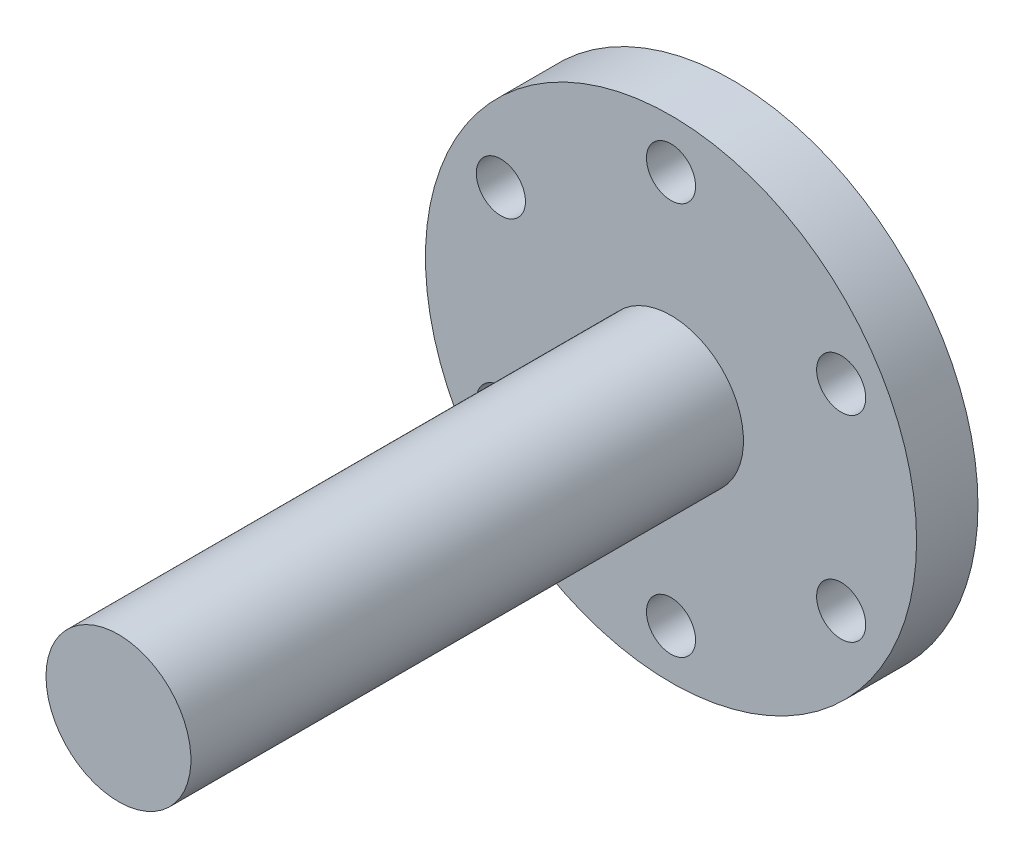
ISO-10303-21;
HEADER;
FILE_DESCRIPTION(('STEP AP214'),'2;1');
FILE_NAME('part.step','',(''),(''),'','','');
FILE_SCHEMA(('AUTOMOTIVE_DESIGN { 1 0 10303 214 1 1 1 1 }'));
ENDSEC;
DATA;
#1=APPLICATION_CONTEXT('core data for automotive mechanical design processes');
#2=APPLICATION_PROTOCOL_DEFINITION('international standard','automotive_design',2000,#1);
#3=PRODUCT_CONTEXT('',#1,'mechanical');
#4=PRODUCT('Part','Part','',(#3));
#5=PRODUCT_RELATED_PRODUCT_CATEGORY('part','',(#4));
#6=PRODUCT_DEFINITION_FORMATION('','',#4);
#7=PRODUCT_DEFINITION_CONTEXT('part definition',#1,'design');
#8=PRODUCT_DEFINITION('design','',#6,#7);
#9=PRODUCT_DEFINITION_SHAPE('','',#8);
#10=(LENGTH_UNIT() NAMED_UNIT(*) SI_UNIT(.MILLI.,.METRE.));
#11=(NAMED_UNIT(*) PLANE_ANGLE_UNIT() SI_UNIT($,.RADIAN.));
#12=(NAMED_UNIT(*) SI_UNIT($,.STERADIAN.) SOLID_ANGLE_UNIT());
#13=UNCERTAINTY_MEASURE_WITH_UNIT(LENGTH_MEASURE(1.E-05),#10,'distance_accuracy_value','');
#14=(GEOMETRIC_REPRESENTATION_CONTEXT(3) GLOBAL_UNCERTAINTY_ASSIGNED_CONTEXT((#13)) GLOBAL_UNIT_ASSIGNED_CONTEXT((#10,
#11,#12)) REPRESENTATION_CONTEXT('',''));
#15=CARTESIAN_POINT('',(0.,0.,0.));
#16=DIRECTION('',(0.,0.,1.));
#17=DIRECTION('',(1.,0.,0.));
#18=AXIS2_PLACEMENT_3D('',#15,#16,#17);
#19=CARTESIAN_POINT('',(0.,0.,5.));
#20=DIRECTION('',(0.,0.,-1.));
#21=DIRECTION('',(-1.,0.,0.));
#22=AXIS2_PLACEMENT_3D('',#19,#20,#21);
#23=CYLINDRICAL_SURFACE('',#22,20.);
#24=CARTESIAN_POINT('',(0.,0.,5.));
#25=DIRECTION('',(0.,0.,1.));
#26=DIRECTION('',(1.,0.,0.));
#27=AXIS2_PLACEMENT_3D('',#24,#25,#26);
#28=CIRCLE('',#27,20.);
#29=CARTESIAN_POINT('',(20.,0.,5.));
#30=VERTEX_POINT('',#29);
#31=EDGE_CURVE('E43',#30,#30,#28,.T.);
#32=ORIENTED_EDGE('',*,*,#31,.F.);
#33=EDGE_LOOP('',(#32));
#34=FACE_BOUND('',#33,.T.);
#35=CARTESIAN_POINT('',(0.,0.,0.));
#36=DIRECTION('',(0.,0.,1.));
#37=DIRECTION('',(1.,0.,0.));
#38=AXIS2_PLACEMENT_3D('',#35,#36,#37);
#39=CIRCLE('',#38,20.);
#40=CARTESIAN_POINT('',(20.,0.,0.));
#41=VERTEX_POINT('',#40);
#42=EDGE_CURVE('E39',#41,#41,#39,.T.);
#43=ORIENTED_EDGE('',*,*,#42,.T.);
#44=EDGE_LOOP('',(#43));
#45=FACE_BOUND('',#44,.T.);
#46=ADVANCED_FACE('F36',(#34,#45),#23,.T.);
#47=CARTESIAN_POINT('',(0.,0.,5.));
#48=DIRECTION('',(0.,0.,1.));
#49=DIRECTION('',(1.,0.,0.));
#50=AXIS2_PLACEMENT_3D('',#47,#48,#49);
#51=PLANE('',#50);
#52=CARTESIAN_POINT('',(0.,16.,5.));
#53=DIRECTION('',(0.,0.,1.));
#54=DIRECTION('',(1.,0.,0.));
#55=AXIS2_PLACEMENT_3D('',#52,#53,#54);
#56=CIRCLE('',#55,2.);
#57=CARTESIAN_POINT('',(2.,16.,5.));
#58=VERTEX_POINT('',#57);
#59=EDGE_CURVE('E78',#58,#58,#56,.T.);
#60=ORIENTED_EDGE('',*,*,#59,.F.);
#61=EDGE_LOOP('',(#60));
#62=FACE_BOUND('',#61,.T.);
#63=CARTESIAN_POINT('',(-13.8564064605506,7.99999999999921,5.));
#64=DIRECTION('',(0.,0.,1.));
#65=DIRECTION('',(1.,0.,0.));
#66=AXIS2_PLACEMENT_3D('',#63,#64,#65);
#67=CIRCLE('',#66,2.00000000000085);
#68=CARTESIAN_POINT('',(-11.8564064605497,7.99999999999921,5.));
#69=VERTEX_POINT('',#68);
#70=EDGE_CURVE('E79',#69,#69,#67,.T.);
#71=ORIENTED_EDGE('',*,*,#70,.F.);
#72=EDGE_LOOP('',(#71));
#73=FACE_BOUND('',#72,.T.);
#74=CARTESIAN_POINT('',(-13.8564064605497,-8.00000000000079,5.));
#75=DIRECTION('',(0.,0.,1.));
#76=DIRECTION('',(1.,0.,0.));
#77=AXIS2_PLACEMENT_3D('',#74,#75,#76);
#78=CIRCLE('',#77,2.00000000000168);
#79=CARTESIAN_POINT('',(-11.856406460548,-8.00000000000079,5.));
#80=VERTEX_POINT('',#79);
#81=EDGE_CURVE('E53',#80,#80,#78,.T.);
#82=ORIENTED_EDGE('',*,*,#81,.F.);
#83=EDGE_LOOP('',(#82));
#84=FACE_BOUND('',#83,.T.);
#85=CARTESIAN_POINT('',(1.81311109890995E-12,-16.,5.));
#86=DIRECTION('',(0.,0.,1.));
#87=DIRECTION('',(1.,0.,0.));
#88=AXIS2_PLACEMENT_3D('',#85,#86,#87);
#89=CIRCLE('',#88,2.00000000000184);
#90=CARTESIAN_POINT('',(2.00000000000365,-16.,5.));
#91=VERTEX_POINT('',#90);
#92=EDGE_CURVE('E60',#91,#91,#89,.T.);
#93=ORIENTED_EDGE('',*,*,#92,.F.);
#94=EDGE_LOOP('',(#93));
#95=FACE_BOUND('',#94,.T.);
#96=CARTESIAN_POINT('',(13.8564064605524,-7.99999999999921,5.));
#97=DIRECTION('',(0.,0.,1.));
#98=DIRECTION('',(1.,0.,0.));
#99=AXIS2_PLACEMENT_3D('',#96,#97,#98);
#100=CIRCLE('',#99,2.00000000000115);
#101=CARTESIAN_POINT('',(15.8564064605535,-7.99999999999921,5.));
#102=VERTEX_POINT('',#101);
#103=EDGE_CURVE('E66',#102,#102,#100,.T.);
#104=ORIENTED_EDGE('',*,*,#103,.F.);
#105=EDGE_LOOP('',(#104));
#106=FACE_BOUND('',#105,.T.);
#107=CARTESIAN_POINT('',(13.8564064605515,8.00000000000079,5.));
#108=DIRECTION('',(0.,0.,1.));
#109=DIRECTION('',(1.,0.,0.));
#110=AXIS2_PLACEMENT_3D('',#107,#108,#109);
#111=CIRCLE('',#110,2.00000000000025);
#112=CARTESIAN_POINT('',(15.8564064605517,8.00000000000079,5.));
#113=VERTEX_POINT('',#112);
#114=EDGE_CURVE('E72',#113,#113,#111,.T.);
#115=ORIENTED_EDGE('',*,*,#114,.F.);
#116=EDGE_LOOP('',(#115));
#117=FACE_BOUND('',#116,.T.);
#118=CARTESIAN_POINT('',(0.,0.,5.));
#119=DIRECTION('',(0.,0.,1.));
#120=DIRECTION('',(1.,0.,0.));
#121=AXIS2_PLACEMENT_3D('',#118,#119,#120);
#122=CIRCLE('',#121,5.9);
#123=CARTESIAN_POINT('',(-5.9,0.,5.));
#124=VERTEX_POINT('',#123);
#125=EDGE_CURVE('E10',#124,#124,#122,.T.);
#126=ORIENTED_EDGE('',*,*,#125,.F.);
#127=EDGE_LOOP('',(#126));
#128=FACE_BOUND('',#127,.T.);
#129=ORIENTED_EDGE('',*,*,#31,.T.);
#130=EDGE_LOOP('',(#129));
#131=FACE_BOUND('',#130,.T.);
#132=ADVANCED_FACE('F99',(#62,#73,#84,#95,#106,#117,#128,#131),#51,.T.);
#133=CARTESIAN_POINT('',(0.,0.,0.));
#134=DIRECTION('',(0.,0.,1.));
#135=DIRECTION('',(1.,0.,0.));
#136=AXIS2_PLACEMENT_3D('',#133,#134,#135);
#137=PLANE('',#136);
#138=CARTESIAN_POINT('',(0.,16.,0.));
#139=DIRECTION('',(0.,0.,1.));
#140=DIRECTION('',(1.,0.,0.));
#141=AXIS2_PLACEMENT_3D('',#138,#139,#140);
#142=CIRCLE('',#141,2.);
#143=CARTESIAN_POINT('',(2.,16.,0.));
#144=VERTEX_POINT('',#143);
#145=EDGE_CURVE('E52',#144,#144,#142,.T.);
#146=ORIENTED_EDGE('',*,*,#145,.T.);
#147=EDGE_LOOP('',(#146));
#148=FACE_BOUND('',#147,.T.);
#149=CARTESIAN_POINT('',(-13.8564064605506,7.99999999999921,0.));
#150=DIRECTION('',(0.,0.,1.));
#151=DIRECTION('',(1.,0.,0.));
#152=AXIS2_PLACEMENT_3D('',#149,#150,#151);
#153=CIRCLE('',#152,2.00000000000085);
#154=CARTESIAN_POINT('',(-11.8564064605497,7.99999999999921,0.));
#155=VERTEX_POINT('',#154);
#156=EDGE_CURVE('E57',#155,#155,#153,.T.);
#157=ORIENTED_EDGE('',*,*,#156,.T.);
#158=EDGE_LOOP('',(#157));
#159=FACE_BOUND('',#158,.T.);
#160=CARTESIAN_POINT('',(-13.8564064605497,-8.00000000000079,0.));
#161=DIRECTION('',(0.,0.,1.));
#162=DIRECTION('',(1.,0.,0.));
#163=AXIS2_PLACEMENT_3D('',#160,#161,#162);
#164=CIRCLE('',#163,2.00000000000168);
#165=CARTESIAN_POINT('',(-11.856406460548,-8.00000000000079,0.));
#166=VERTEX_POINT('',#165);
#167=EDGE_CURVE('E56',#166,#166,#164,.T.);
#168=ORIENTED_EDGE('',*,*,#167,.T.);
#169=EDGE_LOOP('',(#168));
#170=FACE_BOUND('',#169,.T.);
#171=CARTESIAN_POINT('',(1.81311109890995E-12,-16.,0.));
#172=DIRECTION('',(0.,0.,1.));
#173=DIRECTION('',(1.,0.,0.));
#174=AXIS2_PLACEMENT_3D('',#171,#172,#173);
#175=CIRCLE('',#174,2.00000000000184);
#176=CARTESIAN_POINT('',(2.00000000000365,-16.,0.));
#177=VERTEX_POINT('',#176);
#178=EDGE_CURVE('E63',#177,#177,#175,.T.);
#179=ORIENTED_EDGE('',*,*,#178,.T.);
#180=EDGE_LOOP('',(#179));
#181=FACE_BOUND('',#180,.T.);
#182=CARTESIAN_POINT('',(13.8564064605524,-7.99999999999921,0.));
#183=DIRECTION('',(0.,0.,1.));
#184=DIRECTION('',(1.,0.,0.));
#185=AXIS2_PLACEMENT_3D('',#182,#183,#184);
#186=CIRCLE('',#185,2.00000000000115);
#187=CARTESIAN_POINT('',(15.8564064605535,-7.99999999999921,0.));
#188=VERTEX_POINT('',#187);
#189=EDGE_CURVE('E69',#188,#188,#186,.T.);
#190=ORIENTED_EDGE('',*,*,#189,.T.);
#191=EDGE_LOOP('',(#190));
#192=FACE_BOUND('',#191,.T.);
#193=CARTESIAN_POINT('',(13.8564064605515,8.00000000000079,0.));
#194=DIRECTION('',(0.,0.,1.));
#195=DIRECTION('',(1.,0.,0.));
#196=AXIS2_PLACEMENT_3D('',#193,#194,#195);
#197=CIRCLE('',#196,2.00000000000025);
#198=CARTESIAN_POINT('',(15.8564064605517,8.00000000000079,0.));
#199=VERTEX_POINT('',#198);
#200=EDGE_CURVE('E75',#199,#199,#197,.T.);
#201=ORIENTED_EDGE('',*,*,#200,.T.);
#202=EDGE_LOOP('',(#201));
#203=FACE_BOUND('',#202,.T.);
#204=ORIENTED_EDGE('',*,*,#42,.F.);
#205=EDGE_LOOP('',(#204));
#206=FACE_BOUND('',#205,.T.);
#207=ADVANCED_FACE('F89',(#148,#159,#170,#181,#192,#203,#206),#137,.F.);
#208=CARTESIAN_POINT('',(0.,0.,50.));
#209=DIRECTION('',(0.,0.,-1.));
#210=DIRECTION('',(-1.,0.,0.));
#211=AXIS2_PLACEMENT_3D('',#208,#209,#210);
#212=CYLINDRICAL_SURFACE('',#211,5.9);
#213=CARTESIAN_POINT('',(0.,0.,50.));
#214=DIRECTION('',(0.,0.,1.));
#215=DIRECTION('',(1.,0.,0.));
#216=AXIS2_PLACEMENT_3D('',#213,#214,#215);
#217=CIRCLE('',#216,5.9);
#218=CARTESIAN_POINT('',(-5.9,0.,50.));
#219=VERTEX_POINT('',#218);
#220=EDGE_CURVE('E49',#219,#219,#217,.T.);
#221=CARTESIAN_POINT('',(-5.9,0.,50.));
#222=CARTESIAN_POINT('',(-5.9,0.,49.53125));
#223=CARTESIAN_POINT('',(-5.9,0.,49.0625));
#224=CARTESIAN_POINT('',(-5.9,0.,48.125));
#225=CARTESIAN_POINT('',(-5.9,0.,47.65625));
#226=CARTESIAN_POINT('',(-5.9,0.,46.71875));
#227=CARTESIAN_POINT('',(-5.9,0.,46.25));
#228=CARTESIAN_POINT('',(-5.9,0.,45.3125));
#229=CARTESIAN_POINT('',(-5.9,0.,44.84375));
#230=CARTESIAN_POINT('',(-5.9,0.,43.90625));
#231=CARTESIAN_POINT('',(-5.9,0.,43.4375));
#232=CARTESIAN_POINT('',(-5.9,0.,42.5));
#233=CARTESIAN_POINT('',(-5.9,0.,42.03125));
#234=CARTESIAN_POINT('',(-5.9,0.,41.09375));
#235=CARTESIAN_POINT('',(-5.9,0.,40.625));
#236=CARTESIAN_POINT('',(-5.9,0.,39.6875));
#237=CARTESIAN_POINT('',(-5.9,0.,39.21875));
#238=CARTESIAN_POINT('',(-5.9,0.,38.28125));
#239=CARTESIAN_POINT('',(-5.9,0.,37.8125));
#240=CARTESIAN_POINT('',(-5.9,0.,36.875));
#241=CARTESIAN_POINT('',(-5.9,0.,36.40625));
#242=CARTESIAN_POINT('',(-5.9,0.,35.46875));
#243=CARTESIAN_POINT('',(-5.9,0.,35.));
#244=CARTESIAN_POINT('',(-5.9,0.,34.0625));
#245=CARTESIAN_POINT('',(-5.9,0.,33.59375));
#246=CARTESIAN_POINT('',(-5.9,0.,32.65625));
#247=CARTESIAN_POINT('',(-5.9,0.,32.1875));
#248=CARTESIAN_POINT('',(-5.9,0.,31.25));
#249=CARTESIAN_POINT('',(-5.9,0.,30.78125));
#250=CARTESIAN_POINT('',(-5.9,0.,29.84375));
#251=CARTESIAN_POINT('',(-5.9,0.,29.375));
#252=CARTESIAN_POINT('',(-5.9,0.,28.4375));
#253=CARTESIAN_POINT('',(-5.9,0.,27.96875));
#254=CARTESIAN_POINT('',(-5.9,0.,27.03125));
#255=CARTESIAN_POINT('',(-5.9,0.,26.5625));
#256=CARTESIAN_POINT('',(-5.9,0.,25.625));
#257=CARTESIAN_POINT('',(-5.9,0.,25.15625));
#258=CARTESIAN_POINT('',(-5.9,0.,24.21875));
#259=CARTESIAN_POINT('',(-5.9,0.,23.75));
#260=CARTESIAN_POINT('',(-5.9,0.,22.8125));
#261=CARTESIAN_POINT('',(-5.9,0.,22.34375));
#262=CARTESIAN_POINT('',(-5.9,0.,21.40625));
#263=CARTESIAN_POINT('',(-5.9,0.,20.9375));
#264=CARTESIAN_POINT('',(-5.9,0.,20.));
#265=CARTESIAN_POINT('',(-5.9,0.,19.53125));
#266=CARTESIAN_POINT('',(-5.9,0.,18.59375));
#267=CARTESIAN_POINT('',(-5.9,0.,18.125));
#268=CARTESIAN_POINT('',(-5.9,0.,17.1875));
#269=CARTESIAN_POINT('',(-5.9,0.,16.71875));
#270=CARTESIAN_POINT('',(-5.9,0.,15.78125));
#271=CARTESIAN_POINT('',(-5.9,0.,15.3125));
#272=CARTESIAN_POINT('',(-5.9,0.,14.375));
#273=CARTESIAN_POINT('',(-5.9,0.,13.90625));
#274=CARTESIAN_POINT('',(-5.9,0.,12.96875));
#275=CARTESIAN_POINT('',(-5.9,0.,12.5));
#276=CARTESIAN_POINT('',(-5.9,0.,11.5625));
#277=CARTESIAN_POINT('',(-5.9,0.,11.09375));
#278=CARTESIAN_POINT('',(-5.9,0.,10.15625));
#279=CARTESIAN_POINT('',(-5.9,0.,9.6875));
#280=CARTESIAN_POINT('',(-5.9,0.,8.75));
#281=CARTESIAN_POINT('',(-5.9,0.,8.28125));
#282=CARTESIAN_POINT('',(-5.9,0.,7.34375));
#283=CARTESIAN_POINT('',(-5.9,0.,6.875));
#284=CARTESIAN_POINT('',(-5.9,0.,5.9375));
#285=CARTESIAN_POINT('',(-5.9,0.,5.46875));
#286=CARTESIAN_POINT('',(-5.9,0.,5.));
#287=B_SPLINE_CURVE_WITH_KNOTS('',3,(#221,#222,#223,#224,#225,#226,#227,#228,#229,#230,#231,
#232,#233,#234,#235,#236,#237,#238,#239,#240,#241,#242,#243,#244,#245,#246,#247,#248,#249,#250,
#251,#252,#253,#254,#255,#256,#257,#258,#259,#260,#261,#262,#263,#264,#265,#266,#267,#268,#269,
#270,#271,#272,#273,#274,#275,#276,#277,#278,#279,#280,#281,#282,#283,#284,#285,#286),
.UNSPECIFIED.,.F.,.F.,(4,2,2,2,2,2,2,2,2,2,2,2,2,2,2,2,2,2,2,2,2,2,2,2,2,2,2,2,2,2,2,2,4),(0.,
1.40625,2.8125,4.21875000000001,5.62500000000001,7.03125,8.4375,9.84375000000001,11.25,12.65625,
14.0625,15.46875,16.875,18.28125,19.6875,21.09375,22.5,23.90625,25.3125,26.71875,28.125,
29.53125,30.9375,32.34375,33.75,35.15625,36.5625,37.96875,39.375,40.78125,42.1875,43.59375,45.),.UNSPECIFIED.);
#288=EDGE_CURVE('BSEAM122',#219,#124,#287,.T.);
#289=ORIENTED_EDGE('',*,*,#220,.F.);
#290=ORIENTED_EDGE('',*,*,#125,.T.);
#291=ORIENTED_EDGE('',*,*,#288,.T.);
#292=ORIENTED_EDGE('',*,*,#288,.F.);
#293=EDGE_LOOP('',(#289,#291,#290,#292));
#294=FACE_BOUND('',#293,.T.);
#295=ADVANCED_FACE('F122',(#294),#212,.T.);
#296=CARTESIAN_POINT('',(0.,0.,50.));
#297=DIRECTION('',(0.,0.,1.));
#298=DIRECTION('',(1.,0.,0.));
#299=AXIS2_PLACEMENT_3D('',#296,#297,#298);
#300=PLANE('',#299);
#301=ORIENTED_EDGE('',*,*,#220,.T.);
#302=EDGE_LOOP('',(#301));
#303=FACE_BOUND('',#302,.T.);
#304=ADVANCED_FACE('F126',(#303),#300,.T.);
#305=CARTESIAN_POINT('',(13.8564064605515,8.00000000000079,0.));
#306=DIRECTION('',(0.,0.,1.));
#307=DIRECTION('',(1.,0.,0.));
#308=AXIS2_PLACEMENT_3D('',#305,#306,#307);
#309=CYLINDRICAL_SURFACE('',#308,2.00000000000025);
#310=ORIENTED_EDGE('',*,*,#200,.F.);
#311=EDGE_LOOP('',(#310));
#312=FACE_BOUND('',#311,.T.);
#313=ORIENTED_EDGE('',*,*,#114,.T.);
#314=EDGE_LOOP('',(#313));
#315=FACE_BOUND('',#314,.T.);
#316=ADVANCED_FACE('F132',(#312,#315),#309,.F.);
#317=CARTESIAN_POINT('',(13.8564064605524,-7.99999999999921,0.));
#318=DIRECTION('',(0.,0.,1.));
#319=DIRECTION('',(1.,0.,0.));
#320=AXIS2_PLACEMENT_3D('',#317,#318,#319);
#321=CYLINDRICAL_SURFACE('',#320,2.00000000000115);
#322=ORIENTED_EDGE('',*,*,#189,.F.);
#323=EDGE_LOOP('',(#322));
#324=FACE_BOUND('',#323,.T.);
#325=ORIENTED_EDGE('',*,*,#103,.T.);
#326=EDGE_LOOP('',(#325));
#327=FACE_BOUND('',#326,.T.);
#328=ADVANCED_FACE('F141',(#324,#327),#321,.F.);
#329=CARTESIAN_POINT('',(1.81311109890995E-12,-16.,0.));
#330=DIRECTION('',(0.,0.,1.));
#331=DIRECTION('',(1.,0.,0.));
#332=AXIS2_PLACEMENT_3D('',#329,#330,#331);
#333=CYLINDRICAL_SURFACE('',#332,2.00000000000184);
#334=ORIENTED_EDGE('',*,*,#178,.F.);
#335=EDGE_LOOP('',(#334));
#336=FACE_BOUND('',#335,.T.);
#337=ORIENTED_EDGE('',*,*,#92,.T.);
#338=EDGE_LOOP('',(#337));
#339=FACE_BOUND('',#338,.T.);
#340=ADVANCED_FACE('F137',(#336,#339),#333,.F.);
#341=CARTESIAN_POINT('',(-13.8564064605497,-8.00000000000079,0.));
#342=DIRECTION('',(0.,0.,1.));
#343=DIRECTION('',(1.,0.,0.));
#344=AXIS2_PLACEMENT_3D('',#341,#342,#343);
#345=CYLINDRICAL_SURFACE('',#344,2.00000000000168);
#346=ORIENTED_EDGE('',*,*,#167,.F.);
#347=EDGE_LOOP('',(#346));
#348=FACE_BOUND('',#347,.T.);
#349=ORIENTED_EDGE('',*,*,#81,.T.);
#350=EDGE_LOOP('',(#349));
#351=FACE_BOUND('',#350,.T.);
#352=ADVANCED_FACE('F134',(#348,#351),#345,.F.);
#353=CARTESIAN_POINT('',(-13.8564064605506,7.99999999999921,0.));
#354=DIRECTION('',(0.,0.,1.));
#355=DIRECTION('',(1.,0.,0.));
#356=AXIS2_PLACEMENT_3D('',#353,#354,#355);
#357=CYLINDRICAL_SURFACE('',#356,2.00000000000085);
#358=ORIENTED_EDGE('',*,*,#156,.F.);
#359=EDGE_LOOP('',(#358));
#360=FACE_BOUND('',#359,.T.);
#361=ORIENTED_EDGE('',*,*,#70,.T.);
#362=EDGE_LOOP('',(#361));
#363=FACE_BOUND('',#362,.T.);
#364=ADVANCED_FACE('F95',(#360,#363),#357,.F.);
#365=CARTESIAN_POINT('',(0.,16.,0.));
#366=DIRECTION('',(0.,0.,1.));
#367=DIRECTION('',(1.,0.,0.));
#368=AXIS2_PLACEMENT_3D('',#365,#366,#367);
#369=CYLINDRICAL_SURFACE('',#368,2.);
#370=ORIENTED_EDGE('',*,*,#145,.F.);
#371=EDGE_LOOP('',(#370));
#372=FACE_BOUND('',#371,.T.);
#373=ORIENTED_EDGE('',*,*,#59,.T.);
#374=EDGE_LOOP('',(#373));
#375=FACE_BOUND('',#374,.T.);
#376=ADVANCED_FACE('F92',(#372,#375),#369,.F.);
#377=CLOSED_SHELL('',(#46,#132,#207,#295,#304,#316,#328,#340,#352,#364,#376));
#378=MANIFOLD_SOLID_BREP('B2',#377);
#379=ADVANCED_BREP_SHAPE_REPRESENTATION('',(#18,#378),#14);
#380=SHAPE_DEFINITION_REPRESENTATION(#9,#379);
ENDSEC;
END-ISO-10303-21;
